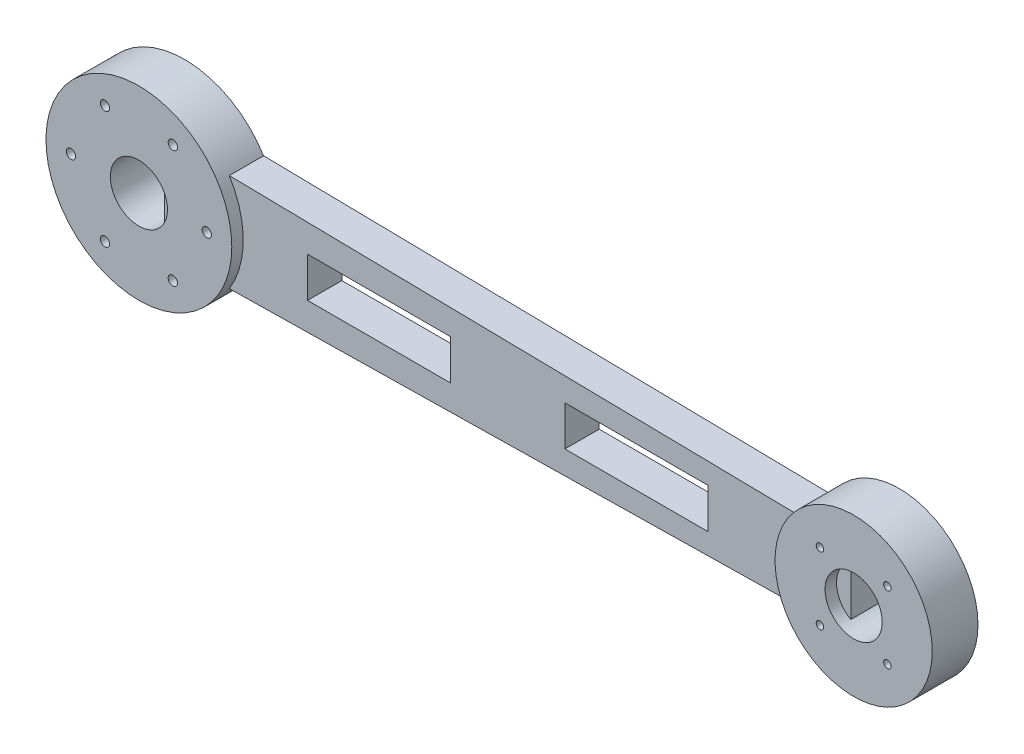
ISO-10303-21;
HEADER;
FILE_DESCRIPTION(('STEP AP214'),'2;1');
FILE_NAME('part.step','',(''),(''),'','','');
FILE_SCHEMA(('AUTOMOTIVE_DESIGN { 1 0 10303 214 1 1 1 1 }'));
ENDSEC;
DATA;
#1=APPLICATION_CONTEXT('core data for automotive mechanical design processes');
#2=APPLICATION_PROTOCOL_DEFINITION('international standard','automotive_design',2000,#1);
#3=PRODUCT_CONTEXT('',#1,'mechanical');
#4=PRODUCT('Part','Part','',(#3));
#5=PRODUCT_RELATED_PRODUCT_CATEGORY('part','',(#4));
#6=PRODUCT_DEFINITION_FORMATION('','',#4);
#7=PRODUCT_DEFINITION_CONTEXT('part definition',#1,'design');
#8=PRODUCT_DEFINITION('design','',#6,#7);
#9=PRODUCT_DEFINITION_SHAPE('','',#8);
#10=(LENGTH_UNIT() NAMED_UNIT(*) SI_UNIT(.MILLI.,.METRE.));
#11=(NAMED_UNIT(*) PLANE_ANGLE_UNIT() SI_UNIT($,.RADIAN.));
#12=(NAMED_UNIT(*) SI_UNIT($,.STERADIAN.) SOLID_ANGLE_UNIT());
#13=UNCERTAINTY_MEASURE_WITH_UNIT(LENGTH_MEASURE(1.E-05),#10,'distance_accuracy_value','');
#14=(GEOMETRIC_REPRESENTATION_CONTEXT(3) GLOBAL_UNCERTAINTY_ASSIGNED_CONTEXT((#13)) GLOBAL_UNIT_ASSIGNED_CONTEXT((#10,
#11,#12)) REPRESENTATION_CONTEXT('',''));
#15=CARTESIAN_POINT('',(0.,0.,0.));
#16=DIRECTION('',(0.,0.,1.));
#17=DIRECTION('',(1.,0.,0.));
#18=AXIS2_PLACEMENT_3D('',#15,#16,#17);
#19=CARTESIAN_POINT('',(490.,-27.,24.));
#20=DIRECTION('',(-0.0166643523339933,0.9998611400396,0.));
#21=DIRECTION('',(-0.9998611400396,-0.0166643523339933,0.));
#22=AXIS2_PLACEMENT_3D('',#19,#20,#21);
#23=PLANE('',#22);
#24=DIRECTION('',(0.,0.,-1.));
#25=VECTOR('',#24,1.);
#26=CARTESIAN_POINT('',(452.441556404354,-27.6259740599274,32.));
#27=LINE('',#26,#25);
#28=CARTESIAN_POINT('',(452.441556404354,-27.6259740599274,24.));
#29=VERTEX_POINT('',#28);
#30=CARTESIAN_POINT('',(452.441556404354,-27.6259740599274,0.));
#31=VERTEX_POINT('',#30);
#32=EDGE_CURVE('E245',#29,#31,#27,.T.);
#33=ORIENTED_EDGE('',*,*,#32,.F.);
#34=DIRECTION('',(0.9998611400396,0.0166643523339933,0.));
#35=VECTOR('',#34,1.);
#36=CARTESIAN_POINT('',(490.,-27.,24.));
#37=LINE('',#36,#35);
#38=CARTESIAN_POINT('',(55.2468945218947,-34.2458850913018,24.));
#39=VERTEX_POINT('',#38);
#40=EDGE_CURVE('E173',#39,#29,#37,.T.);
#41=ORIENTED_EDGE('',*,*,#40,.F.);
#42=DIRECTION('',(0.,0.,-1.));
#43=VECTOR('',#42,1.);
#44=CARTESIAN_POINT('',(55.2468945218947,-34.2458850913018,32.));
#45=LINE('',#44,#43);
#46=CARTESIAN_POINT('',(55.2468945218947,-34.2458850913018,0.));
#47=VERTEX_POINT('',#46);
#48=EDGE_CURVE('E56',#39,#47,#45,.T.);
#49=ORIENTED_EDGE('',*,*,#48,.T.);
#50=DIRECTION('',(0.9998611400396,0.0166643523339933,0.));
#51=VECTOR('',#50,1.);
#52=CARTESIAN_POINT('',(490.,-27.,0.));
#53=LINE('',#52,#51);
#54=EDGE_CURVE('E163',#47,#31,#53,.T.);
#55=ORIENTED_EDGE('',*,*,#54,.T.);
#56=EDGE_LOOP('',(#33,#41,#49,#55));
#57=FACE_BOUND('',#56,.T.);
#58=ADVANCED_FACE('F33',(#57),#23,.F.);
#59=CARTESIAN_POINT('',(10.,35.,24.));
#60=DIRECTION('',(-0.0166643523339933,-0.9998611400396,0.));
#61=DIRECTION('',(0.9998611400396,-0.0166643523339933,0.));
#62=AXIS2_PLACEMENT_3D('',#59,#60,#61);
#63=PLANE('',#62);
#64=DIRECTION('',(0.,0.,-1.));
#65=VECTOR('',#64,1.);
#66=CARTESIAN_POINT('',(452.441556404354,27.6259740599274,32.));
#67=LINE('',#66,#65);
#68=CARTESIAN_POINT('',(452.441556404354,27.6259740599274,0.));
#69=VERTEX_POINT('',#68);
#70=CARTESIAN_POINT('',(452.441556404354,27.6259740599274,24.));
#71=VERTEX_POINT('',#70);
#72=EDGE_CURVE('E242',#69,#71,#67,.F.);
#73=ORIENTED_EDGE('',*,*,#72,.F.);
#74=DIRECTION('',(-0.9998611400396,0.0166643523339933,0.));
#75=VECTOR('',#74,1.);
#76=CARTESIAN_POINT('',(10.,35.,0.));
#77=LINE('',#76,#75);
#78=CARTESIAN_POINT('',(55.2468945218947,34.2458850913018,0.));
#79=VERTEX_POINT('',#78);
#80=EDGE_CURVE('E162',#69,#79,#77,.T.);
#81=ORIENTED_EDGE('',*,*,#80,.T.);
#82=DIRECTION('',(0.,0.,-1.));
#83=VECTOR('',#82,1.);
#84=CARTESIAN_POINT('',(55.2468945218947,34.2458850913018,32.));
#85=LINE('',#84,#83);
#86=CARTESIAN_POINT('',(55.2468945218947,34.2458850913018,24.));
#87=VERTEX_POINT('',#86);
#88=EDGE_CURVE('E233',#79,#87,#85,.F.);
#89=ORIENTED_EDGE('',*,*,#88,.T.);
#90=DIRECTION('',(-0.9998611400396,0.0166643523339933,0.));
#91=VECTOR('',#90,1.);
#92=CARTESIAN_POINT('',(10.,35.,24.));
#93=LINE('',#92,#91);
#94=EDGE_CURVE('E319',#71,#87,#93,.T.);
#95=ORIENTED_EDGE('',*,*,#94,.F.);
#96=EDGE_LOOP('',(#73,#81,#89,#95));
#97=FACE_BOUND('',#96,.T.);
#98=ADVANCED_FACE('F362',(#97),#63,.F.);
#99=CARTESIAN_POINT('',(0.,0.,24.));
#100=DIRECTION('',(0.,0.,-1.));
#101=DIRECTION('',(-1.,0.,0.));
#102=AXIS2_PLACEMENT_3D('',#99,#100,#101);
#103=PLANE('',#102);
#104=DIRECTION('',(0.,1.,0.));
#105=VECTOR('',#104,1.);
#106=CARTESIAN_POINT('',(490.,27.,24.));
#107=LINE('',#106,#105);
#108=CARTESIAN_POINT('',(490.,-17.3205080756887,24.));
#109=VERTEX_POINT('',#108);
#110=CARTESIAN_POINT('',(490.,17.3205080756887,24.));
#111=VERTEX_POINT('',#110);
#112=EDGE_CURVE('E317',#109,#111,#107,.T.);
#113=ORIENTED_EDGE('',*,*,#112,.T.);
#114=CARTESIAN_POINT('',(500.,0.,24.));
#115=DIRECTION('',(0.,0.,-1.));
#116=DIRECTION('',(-1.,0.,0.));
#117=AXIS2_PLACEMENT_3D('',#114,#115,#116);
#118=CIRCLE('',#117,20.);
#119=EDGE_CURVE('E146',#111,#109,#118,.F.);
#120=ORIENTED_EDGE('',*,*,#119,.T.);
#121=EDGE_LOOP('',(#113,#120));
#122=FACE_BOUND('',#121,.T.);
#123=ADVANCED_FACE('F368',(#122),#103,.F.);
#124=CARTESIAN_POINT('',(0.,0.,32.));
#125=DIRECTION('',(0.,0.,-1.));
#126=DIRECTION('',(-1.,0.,0.));
#127=AXIS2_PLACEMENT_3D('',#124,#125,#126);
#128=CYLINDRICAL_SURFACE('',#127,65.);
#129=CARTESIAN_POINT('',(0.,0.,32.));
#130=DIRECTION('',(0.,0.,1.));
#131=DIRECTION('',(1.,0.,0.));
#132=AXIS2_PLACEMENT_3D('',#129,#130,#131);
#133=CIRCLE('',#132,65.);
#134=CARTESIAN_POINT('',(65.,0.,32.));
#135=VERTEX_POINT('',#134);
#136=EDGE_CURVE('E220',#135,#135,#133,.T.);
#137=ORIENTED_EDGE('',*,*,#136,.F.);
#138=EDGE_LOOP('',(#137));
#139=FACE_BOUND('',#138,.T.);
#140=ORIENTED_EDGE('',*,*,#48,.F.);
#141=CARTESIAN_POINT('',(0.,0.,24.));
#142=DIRECTION('',(0.,0.,-1.));
#143=DIRECTION('',(-1.,0.,0.));
#144=AXIS2_PLACEMENT_3D('',#141,#142,#143);
#145=CIRCLE('',#144,65.);
#146=EDGE_CURVE('E177',#87,#39,#145,.T.);
#147=ORIENTED_EDGE('',*,*,#146,.F.);
#148=ORIENTED_EDGE('',*,*,#88,.F.);
#149=CARTESIAN_POINT('',(0.,0.,0.));
#150=DIRECTION('',(0.,0.,1.));
#151=DIRECTION('',(1.,0.,0.));
#152=AXIS2_PLACEMENT_3D('',#149,#150,#151);
#153=CIRCLE('',#152,65.);
#154=EDGE_CURVE('E217',#79,#47,#153,.T.);
#155=ORIENTED_EDGE('',*,*,#154,.T.);
#156=EDGE_LOOP('',(#140,#147,#148,#155));
#157=FACE_BOUND('',#156,.T.);
#158=ADVANCED_FACE('F35',(#139,#157),#128,.T.);
#159=CARTESIAN_POINT('',(0.,0.,32.));
#160=DIRECTION('',(0.,0.,-1.));
#161=DIRECTION('',(-1.,0.,0.));
#162=AXIS2_PLACEMENT_3D('',#159,#160,#161);
#163=CYLINDRICAL_SURFACE('',#162,20.);
#164=CARTESIAN_POINT('',(0.,0.,32.));
#165=DIRECTION('',(0.,0.,1.));
#166=DIRECTION('',(1.,0.,0.));
#167=AXIS2_PLACEMENT_3D('',#164,#165,#166);
#168=CIRCLE('',#167,20.);
#169=CARTESIAN_POINT('',(20.,0.,32.));
#170=VERTEX_POINT('',#169);
#171=EDGE_CURVE('E214',#170,#170,#168,.T.);
#172=ORIENTED_EDGE('',*,*,#171,.T.);
#173=EDGE_LOOP('',(#172));
#174=FACE_BOUND('',#173,.T.);
#175=CARTESIAN_POINT('',(0.,0.,24.));
#176=DIRECTION('',(0.,0.,-1.));
#177=DIRECTION('',(-1.,0.,0.));
#178=AXIS2_PLACEMENT_3D('',#175,#176,#177);
#179=CIRCLE('',#178,20.);
#180=CARTESIAN_POINT('',(10.,17.3205080756888,24.));
#181=VERTEX_POINT('',#180);
#182=CARTESIAN_POINT('',(10.,-17.3205080756888,24.));
#183=VERTEX_POINT('',#182);
#184=EDGE_CURVE('E174',#181,#183,#179,.T.);
#185=ORIENTED_EDGE('',*,*,#184,.T.);
#186=DIRECTION('',(0.,0.,-1.));
#187=VECTOR('',#186,1.);
#188=CARTESIAN_POINT('',(10.,-17.3205080756888,32.));
#189=LINE('',#188,#187);
#190=CARTESIAN_POINT('',(10.,-17.3205080756888,0.));
#191=VERTEX_POINT('',#190);
#192=EDGE_CURVE('E230',#183,#191,#189,.T.);
#193=ORIENTED_EDGE('',*,*,#192,.T.);
#194=CARTESIAN_POINT('',(0.,0.,0.));
#195=DIRECTION('',(0.,0.,1.));
#196=DIRECTION('',(1.,0.,0.));
#197=AXIS2_PLACEMENT_3D('',#194,#195,#196);
#198=CIRCLE('',#197,20.);
#199=CARTESIAN_POINT('',(10.,17.3205080756888,0.));
#200=VERTEX_POINT('',#199);
#201=EDGE_CURVE('E213',#200,#191,#198,.T.);
#202=ORIENTED_EDGE('',*,*,#201,.F.);
#203=DIRECTION('',(0.,0.,-1.));
#204=VECTOR('',#203,1.);
#205=CARTESIAN_POINT('',(10.,17.3205080756888,32.));
#206=LINE('',#205,#204);
#207=EDGE_CURVE('E223',#200,#181,#206,.F.);
#208=ORIENTED_EDGE('',*,*,#207,.T.);
#209=EDGE_LOOP('',(#185,#193,#202,#208));
#210=FACE_BOUND('',#209,.T.);
#211=ADVANCED_FACE('F326',(#174,#210),#163,.F.);
#212=CARTESIAN_POINT('',(47.5,0.,32.));
#213=DIRECTION('',(0.,0.,-1.));
#214=DIRECTION('',(-1.,0.,0.));
#215=AXIS2_PLACEMENT_3D('',#212,#213,#214);
#216=CYLINDRICAL_SURFACE('',#215,3.25);
#217=CARTESIAN_POINT('',(47.5,0.,32.));
#218=DIRECTION('',(0.,0.,1.));
#219=DIRECTION('',(1.,0.,0.));
#220=AXIS2_PLACEMENT_3D('',#217,#218,#219);
#221=CIRCLE('',#220,3.25);
#222=CARTESIAN_POINT('',(50.75,0.,32.));
#223=VERTEX_POINT('',#222);
#224=EDGE_CURVE('E208',#223,#223,#221,.T.);
#225=ORIENTED_EDGE('',*,*,#224,.T.);
#226=EDGE_LOOP('',(#225));
#227=FACE_BOUND('',#226,.T.);
#228=CARTESIAN_POINT('',(47.5,0.,24.));
#229=DIRECTION('',(0.,0.,-1.));
#230=DIRECTION('',(-1.,0.,0.));
#231=AXIS2_PLACEMENT_3D('',#228,#229,#230);
#232=CIRCLE('',#231,3.25);
#233=CARTESIAN_POINT('',(44.25,0.,24.));
#234=VERTEX_POINT('',#233);
#235=EDGE_CURVE('E178',#234,#234,#232,.T.);
#236=ORIENTED_EDGE('',*,*,#235,.T.);
#237=EDGE_LOOP('',(#236));
#238=FACE_BOUND('',#237,.T.);
#239=ADVANCED_FACE('F392',(#227,#238),#216,.F.);
#240=CARTESIAN_POINT('',(0.,0.,32.));
#241=DIRECTION('',(0.,0.,1.));
#242=DIRECTION('',(1.,0.,0.));
#243=AXIS2_PLACEMENT_3D('',#240,#241,#242);
#244=PLANE('',#243);
#245=CARTESIAN_POINT('',(-23.75,-41.1362066797608,32.));
#246=DIRECTION('',(0.,0.,1.));
#247=DIRECTION('',(1.,0.,0.));
#248=AXIS2_PLACEMENT_3D('',#245,#246,#247);
#249=CIRCLE('',#248,3.24999999999997);
#250=CARTESIAN_POINT('',(-20.5,-41.1362066797608,32.));
#251=VERTEX_POINT('',#250);
#252=EDGE_CURVE('E187',#251,#251,#249,.T.);
#253=ORIENTED_EDGE('',*,*,#252,.F.);
#254=EDGE_LOOP('',(#253));
#255=FACE_BOUND('',#254,.T.);
#256=CARTESIAN_POINT('',(-23.75,41.1362066797608,32.));
#257=DIRECTION('',(0.,0.,1.));
#258=DIRECTION('',(1.,0.,0.));
#259=AXIS2_PLACEMENT_3D('',#256,#257,#258);
#260=CIRCLE('',#259,3.25);
#261=CARTESIAN_POINT('',(-20.5,41.1362066797608,32.));
#262=VERTEX_POINT('',#261);
#263=EDGE_CURVE('E199',#262,#262,#260,.T.);
#264=ORIENTED_EDGE('',*,*,#263,.F.);
#265=EDGE_LOOP('',(#264));
#266=FACE_BOUND('',#265,.T.);
#267=ORIENTED_EDGE('',*,*,#224,.F.);
#268=EDGE_LOOP('',(#267));
#269=FACE_BOUND('',#268,.T.);
#270=ORIENTED_EDGE('',*,*,#136,.T.);
#271=EDGE_LOOP('',(#270));
#272=FACE_BOUND('',#271,.T.);
#273=ORIENTED_EDGE('',*,*,#171,.F.);
#274=EDGE_LOOP('',(#273));
#275=FACE_BOUND('',#274,.T.);
#276=CARTESIAN_POINT('',(23.75,41.1362066797608,32.));
#277=DIRECTION('',(0.,0.,1.));
#278=DIRECTION('',(1.,0.,0.));
#279=AXIS2_PLACEMENT_3D('',#276,#277,#278);
#280=CIRCLE('',#279,3.25);
#281=CARTESIAN_POINT('',(27.,41.1362066797608,32.));
#282=VERTEX_POINT('',#281);
#283=EDGE_CURVE('E205',#282,#282,#280,.T.);
#284=ORIENTED_EDGE('',*,*,#283,.F.);
#285=EDGE_LOOP('',(#284));
#286=FACE_BOUND('',#285,.T.);
#287=CARTESIAN_POINT('',(-47.5,0.,32.));
#288=DIRECTION('',(0.,0.,1.));
#289=DIRECTION('',(1.,0.,0.));
#290=AXIS2_PLACEMENT_3D('',#287,#288,#289);
#291=CIRCLE('',#290,3.25);
#292=CARTESIAN_POINT('',(-44.25,0.,32.));
#293=VERTEX_POINT('',#292);
#294=EDGE_CURVE('E193',#293,#293,#291,.T.);
#295=ORIENTED_EDGE('',*,*,#294,.F.);
#296=EDGE_LOOP('',(#295));
#297=FACE_BOUND('',#296,.T.);
#298=CARTESIAN_POINT('',(23.75,-41.1362066797608,32.));
#299=DIRECTION('',(0.,0.,1.));
#300=DIRECTION('',(1.,0.,0.));
#301=AXIS2_PLACEMENT_3D('',#298,#299,#300);
#302=CIRCLE('',#301,3.24999999999996);
#303=CARTESIAN_POINT('',(27.,-41.1362066797608,32.));
#304=VERTEX_POINT('',#303);
#305=EDGE_CURVE('E181',#304,#304,#302,.T.);
#306=ORIENTED_EDGE('',*,*,#305,.F.);
#307=EDGE_LOOP('',(#306));
#308=FACE_BOUND('',#307,.T.);
#309=ADVANCED_FACE('F334',(#255,#266,#269,#272,#275,#286,#297,#308),#244,.T.);
#310=CARTESIAN_POINT('',(0.,0.,0.));
#311=DIRECTION('',(0.,0.,1.));
#312=DIRECTION('',(1.,0.,0.));
#313=AXIS2_PLACEMENT_3D('',#310,#311,#312);
#314=PLANE('',#313);
#315=ORIENTED_EDGE('',*,*,#80,.F.);
#316=CARTESIAN_POINT('',(500.,0.,0.));
#317=DIRECTION('',(0.,0.,1.));
#318=DIRECTION('',(1.,0.,0.));
#319=AXIS2_PLACEMENT_3D('',#316,#317,#318);
#320=CIRCLE('',#319,55.0000000000001);
#321=EDGE_CURVE('E725',#31,#69,#320,.T.);
#322=ORIENTED_EDGE('',*,*,#321,.F.);
#323=ORIENTED_EDGE('',*,*,#54,.F.);
#324=ORIENTED_EDGE('',*,*,#154,.F.);
#325=EDGE_LOOP('',(#315,#322,#323,#324));
#326=FACE_BOUND('',#325,.T.);
#327=ORIENTED_EDGE('',*,*,#201,.T.);
#328=DIRECTION('',(0.,-1.,0.));
#329=VECTOR('',#328,1.);
#330=CARTESIAN_POINT('',(10.,-35.,0.));
#331=LINE('',#330,#329);
#332=EDGE_CURVE('E165',#200,#191,#331,.T.);
#333=ORIENTED_EDGE('',*,*,#332,.F.);
#334=EDGE_LOOP('',(#327,#333));
#335=FACE_BOUND('',#334,.T.);
#336=DIRECTION('',(1.,0.,0.));
#337=VECTOR('',#336,1.);
#338=CARTESIAN_POINT('',(110.,-14.,0.));
#339=LINE('',#338,#337);
#340=CARTESIAN_POINT('',(110.,-14.,0.));
#341=VERTEX_POINT('',#340);
#342=CARTESIAN_POINT('',(210.,-14.,0.));
#343=VERTEX_POINT('',#342);
#344=EDGE_CURVE('E289',#341,#343,#339,.T.);
#345=ORIENTED_EDGE('',*,*,#344,.T.);
#346=DIRECTION('',(0.,1.,0.));
#347=VECTOR('',#346,1.);
#348=CARTESIAN_POINT('',(210.,-14.,0.));
#349=LINE('',#348,#347);
#350=CARTESIAN_POINT('',(210.,14.,0.));
#351=VERTEX_POINT('',#350);
#352=EDGE_CURVE('E285',#343,#351,#349,.T.);
#353=ORIENTED_EDGE('',*,*,#352,.T.);
#354=DIRECTION('',(-1.,0.,0.));
#355=VECTOR('',#354,1.);
#356=CARTESIAN_POINT('',(110.,14.,0.));
#357=LINE('',#356,#355);
#358=CARTESIAN_POINT('',(110.,14.,0.));
#359=VERTEX_POINT('',#358);
#360=EDGE_CURVE('E299',#351,#359,#357,.T.);
#361=ORIENTED_EDGE('',*,*,#360,.T.);
#362=DIRECTION('',(0.,-1.,0.));
#363=VECTOR('',#362,1.);
#364=CARTESIAN_POINT('',(110.,-14.,0.));
#365=LINE('',#364,#363);
#366=EDGE_CURVE('E302',#359,#341,#365,.T.);
#367=ORIENTED_EDGE('',*,*,#366,.T.);
#368=EDGE_LOOP('',(#345,#353,#361,#367));
#369=FACE_BOUND('',#368,.T.);
#370=DIRECTION('',(1.,0.,0.));
#371=VECTOR('',#370,1.);
#372=CARTESIAN_POINT('',(290.,-14.,0.));
#373=LINE('',#372,#371);
#374=CARTESIAN_POINT('',(290.,-14.,0.));
#375=VERTEX_POINT('',#374);
#376=CARTESIAN_POINT('',(390.,-14.,0.));
#377=VERTEX_POINT('',#376);
#378=EDGE_CURVE('E258',#375,#377,#373,.T.);
#379=ORIENTED_EDGE('',*,*,#378,.T.);
#380=DIRECTION('',(0.,1.,0.));
#381=VECTOR('',#380,1.);
#382=CARTESIAN_POINT('',(390.,-14.,0.));
#383=LINE('',#382,#381);
#384=CARTESIAN_POINT('',(390.,14.,0.));
#385=VERTEX_POINT('',#384);
#386=EDGE_CURVE('E250',#377,#385,#383,.T.);
#387=ORIENTED_EDGE('',*,*,#386,.T.);
#388=DIRECTION('',(-1.,0.,0.));
#389=VECTOR('',#388,1.);
#390=CARTESIAN_POINT('',(290.,14.,0.));
#391=LINE('',#390,#389);
#392=CARTESIAN_POINT('',(290.,14.,0.));
#393=VERTEX_POINT('',#392);
#394=EDGE_CURVE('E268',#385,#393,#391,.T.);
#395=ORIENTED_EDGE('',*,*,#394,.T.);
#396=DIRECTION('',(0.,-1.,0.));
#397=VECTOR('',#396,1.);
#398=CARTESIAN_POINT('',(290.,-14.,0.));
#399=LINE('',#398,#397);
#400=EDGE_CURVE('E271',#393,#375,#399,.T.);
#401=ORIENTED_EDGE('',*,*,#400,.T.);
#402=EDGE_LOOP('',(#379,#387,#395,#401));
#403=FACE_BOUND('',#402,.T.);
#404=CARTESIAN_POINT('',(23.75,-41.1362066797608,0.));
#405=DIRECTION('',(0.,0.,1.));
#406=DIRECTION('',(1.,0.,0.));
#407=AXIS2_PLACEMENT_3D('',#404,#405,#406);
#408=CIRCLE('',#407,3.24999999999996);
#409=CARTESIAN_POINT('',(27.,-41.1362066797608,0.));
#410=VERTEX_POINT('',#409);
#411=EDGE_CURVE('E180',#410,#410,#408,.T.);
#412=ORIENTED_EDGE('',*,*,#411,.T.);
#413=EDGE_LOOP('',(#412));
#414=FACE_BOUND('',#413,.T.);
#415=CARTESIAN_POINT('',(-23.75,-41.1362066797608,0.));
#416=DIRECTION('',(0.,0.,1.));
#417=DIRECTION('',(1.,0.,0.));
#418=AXIS2_PLACEMENT_3D('',#415,#416,#417);
#419=CIRCLE('',#418,3.24999999999997);
#420=CARTESIAN_POINT('',(-20.5,-41.1362066797608,0.));
#421=VERTEX_POINT('',#420);
#422=EDGE_CURVE('E184',#421,#421,#419,.T.);
#423=ORIENTED_EDGE('',*,*,#422,.T.);
#424=EDGE_LOOP('',(#423));
#425=FACE_BOUND('',#424,.T.);
#426=CARTESIAN_POINT('',(-47.5,0.,0.));
#427=DIRECTION('',(0.,0.,1.));
#428=DIRECTION('',(1.,0.,0.));
#429=AXIS2_PLACEMENT_3D('',#426,#427,#428);
#430=CIRCLE('',#429,3.25);
#431=CARTESIAN_POINT('',(-44.25,0.,0.));
#432=VERTEX_POINT('',#431);
#433=EDGE_CURVE('E190',#432,#432,#430,.T.);
#434=ORIENTED_EDGE('',*,*,#433,.T.);
#435=EDGE_LOOP('',(#434));
#436=FACE_BOUND('',#435,.T.);
#437=CARTESIAN_POINT('',(-23.75,41.1362066797608,0.));
#438=DIRECTION('',(0.,0.,1.));
#439=DIRECTION('',(1.,0.,0.));
#440=AXIS2_PLACEMENT_3D('',#437,#438,#439);
#441=CIRCLE('',#440,3.25);
#442=CARTESIAN_POINT('',(-20.5,41.1362066797608,0.));
#443=VERTEX_POINT('',#442);
#444=EDGE_CURVE('E196',#443,#443,#441,.T.);
#445=ORIENTED_EDGE('',*,*,#444,.T.);
#446=EDGE_LOOP('',(#445));
#447=FACE_BOUND('',#446,.T.);
#448=CARTESIAN_POINT('',(23.75,41.1362066797608,0.));
#449=DIRECTION('',(0.,0.,1.));
#450=DIRECTION('',(1.,0.,0.));
#451=AXIS2_PLACEMENT_3D('',#448,#449,#450);
#452=CIRCLE('',#451,3.25);
#453=CARTESIAN_POINT('',(27.,41.1362066797608,0.));
#454=VERTEX_POINT('',#453);
#455=EDGE_CURVE('E202',#454,#454,#452,.T.);
#456=ORIENTED_EDGE('',*,*,#455,.T.);
#457=EDGE_LOOP('',(#456));
#458=FACE_BOUND('',#457,.T.);
#459=CARTESIAN_POINT('',(500.,0.,0.));
#460=DIRECTION('',(0.,0.,1.));
#461=DIRECTION('',(1.,0.,0.));
#462=AXIS2_PLACEMENT_3D('',#459,#460,#461);
#463=CIRCLE('',#462,20.);
#464=CARTESIAN_POINT('',(490.,-17.3205080756887,0.));
#465=VERTEX_POINT('',#464);
#466=CARTESIAN_POINT('',(490.,17.3205080756887,0.));
#467=VERTEX_POINT('',#466);
#468=EDGE_CURVE('E48',#465,#467,#463,.T.);
#469=ORIENTED_EDGE('',*,*,#468,.T.);
#470=DIRECTION('',(0.,1.,0.));
#471=VECTOR('',#470,1.);
#472=CARTESIAN_POINT('',(490.,27.,0.));
#473=LINE('',#472,#471);
#474=EDGE_CURVE('E157',#465,#467,#473,.T.);
#475=ORIENTED_EDGE('',*,*,#474,.F.);
#476=EDGE_LOOP('',(#469,#475));
#477=FACE_BOUND('',#476,.T.);
#478=CARTESIAN_POINT('',(523.57,23.57,0.));
#479=DIRECTION('',(0.,0.,1.));
#480=DIRECTION('',(1.,0.,0.));
#481=AXIS2_PLACEMENT_3D('',#478,#479,#480);
#482=CIRCLE('',#481,2.60000000000007);
#483=CARTESIAN_POINT('',(526.17,23.57,0.));
#484=VERTEX_POINT('',#483);
#485=EDGE_CURVE('E709',#484,#484,#482,.T.);
#486=ORIENTED_EDGE('',*,*,#485,.T.);
#487=EDGE_LOOP('',(#486));
#488=FACE_BOUND('',#487,.T.);
#489=CARTESIAN_POINT('',(523.57,-23.57,0.));
#490=DIRECTION('',(0.,0.,1.));
#491=DIRECTION('',(1.,0.,0.));
#492=AXIS2_PLACEMENT_3D('',#489,#490,#491);
#493=CIRCLE('',#492,2.60000000000007);
#494=CARTESIAN_POINT('',(526.17,-23.57,0.));
#495=VERTEX_POINT('',#494);
#496=EDGE_CURVE('E711',#495,#495,#493,.T.);
#497=ORIENTED_EDGE('',*,*,#496,.T.);
#498=EDGE_LOOP('',(#497));
#499=FACE_BOUND('',#498,.T.);
#500=ADVANCED_FACE('F155',(#326,#335,#369,#403,#414,#425,#436,#447,#458,#477,#488,#499),#314,.F.);
#501=CARTESIAN_POINT('',(23.75,41.1362066797608,32.));
#502=DIRECTION('',(0.,0.,-1.));
#503=DIRECTION('',(-1.,0.,0.));
#504=AXIS2_PLACEMENT_3D('',#501,#502,#503);
#505=CYLINDRICAL_SURFACE('',#504,3.25);
#506=ORIENTED_EDGE('',*,*,#283,.T.);
#507=EDGE_LOOP('',(#506));
#508=FACE_BOUND('',#507,.T.);
#509=ORIENTED_EDGE('',*,*,#455,.F.);
#510=EDGE_LOOP('',(#509));
#511=FACE_BOUND('',#510,.T.);
#512=ADVANCED_FACE('F333',(#508,#511),#505,.F.);
#513=CARTESIAN_POINT('',(-23.75,41.1362066797608,32.));
#514=DIRECTION('',(0.,0.,-1.));
#515=DIRECTION('',(-1.,0.,0.));
#516=AXIS2_PLACEMENT_3D('',#513,#514,#515);
#517=CYLINDRICAL_SURFACE('',#516,3.25);
#518=ORIENTED_EDGE('',*,*,#263,.T.);
#519=EDGE_LOOP('',(#518));
#520=FACE_BOUND('',#519,.T.);
#521=ORIENTED_EDGE('',*,*,#444,.F.);
#522=EDGE_LOOP('',(#521));
#523=FACE_BOUND('',#522,.T.);
#524=ADVANCED_FACE('F351',(#520,#523),#517,.F.);
#525=CARTESIAN_POINT('',(-47.5,0.,32.));
#526=DIRECTION('',(0.,0.,-1.));
#527=DIRECTION('',(-1.,0.,0.));
#528=AXIS2_PLACEMENT_3D('',#525,#526,#527);
#529=CYLINDRICAL_SURFACE('',#528,3.25);
#530=ORIENTED_EDGE('',*,*,#294,.T.);
#531=EDGE_LOOP('',(#530));
#532=FACE_BOUND('',#531,.T.);
#533=ORIENTED_EDGE('',*,*,#433,.F.);
#534=EDGE_LOOP('',(#533));
#535=FACE_BOUND('',#534,.T.);
#536=ADVANCED_FACE('F357',(#532,#535),#529,.F.);
#537=CARTESIAN_POINT('',(-23.75,-41.1362066797608,32.));
#538=DIRECTION('',(0.,0.,-1.));
#539=DIRECTION('',(-1.,0.,0.));
#540=AXIS2_PLACEMENT_3D('',#537,#538,#539);
#541=CYLINDRICAL_SURFACE('',#540,3.24999999999997);
#542=ORIENTED_EDGE('',*,*,#252,.T.);
#543=EDGE_LOOP('',(#542));
#544=FACE_BOUND('',#543,.T.);
#545=ORIENTED_EDGE('',*,*,#422,.F.);
#546=EDGE_LOOP('',(#545));
#547=FACE_BOUND('',#546,.T.);
#548=ADVANCED_FACE('F378',(#544,#547),#541,.F.);
#549=CARTESIAN_POINT('',(23.75,-41.1362066797608,32.));
#550=DIRECTION('',(0.,0.,-1.));
#551=DIRECTION('',(-1.,0.,0.));
#552=AXIS2_PLACEMENT_3D('',#549,#550,#551);
#553=CYLINDRICAL_SURFACE('',#552,3.24999999999996);
#554=ORIENTED_EDGE('',*,*,#305,.T.);
#555=EDGE_LOOP('',(#554));
#556=FACE_BOUND('',#555,.T.);
#557=ORIENTED_EDGE('',*,*,#411,.F.);
#558=EDGE_LOOP('',(#557));
#559=FACE_BOUND('',#558,.T.);
#560=ADVANCED_FACE('F374',(#556,#559),#553,.F.);
#561=ORIENTED_EDGE('',*,*,#235,.F.);
#562=EDGE_LOOP('',(#561));
#563=FACE_BOUND('',#562,.T.);
#564=ADVANCED_FACE('F377',(#563),#103,.F.);
#565=CARTESIAN_POINT('',(10.,-35.,24.));
#566=DIRECTION('',(1.,0.,0.));
#567=DIRECTION('',(0.,0.,-1.));
#568=AXIS2_PLACEMENT_3D('',#565,#566,#567);
#569=PLANE('',#568);
#570=ORIENTED_EDGE('',*,*,#192,.F.);
#571=DIRECTION('',(0.,-1.,0.));
#572=VECTOR('',#571,1.);
#573=CARTESIAN_POINT('',(10.,-35.,24.));
#574=LINE('',#573,#572);
#575=EDGE_CURVE('E227',#181,#183,#574,.T.);
#576=ORIENTED_EDGE('',*,*,#575,.F.);
#577=ORIENTED_EDGE('',*,*,#207,.F.);
#578=ORIENTED_EDGE('',*,*,#332,.T.);
#579=EDGE_LOOP('',(#570,#576,#577,#578));
#580=FACE_BOUND('',#579,.T.);
#581=ADVANCED_FACE('F329',(#580),#569,.F.);
#582=ORIENTED_EDGE('',*,*,#184,.F.);
#583=ORIENTED_EDGE('',*,*,#575,.T.);
#584=EDGE_LOOP('',(#582,#583));
#585=FACE_BOUND('',#584,.T.);
#586=ADVANCED_FACE('F323',(#585),#103,.F.);
#587=CARTESIAN_POINT('',(500.,0.,24.));
#588=DIRECTION('',(0.,0.,-1.));
#589=DIRECTION('',(-1.,0.,0.));
#590=AXIS2_PLACEMENT_3D('',#587,#588,#589);
#591=CIRCLE('',#590,55.0000000000001);
#592=EDGE_CURVE('E11',#71,#29,#591,.F.);
#593=ORIENTED_EDGE('',*,*,#592,.F.);
#594=ORIENTED_EDGE('',*,*,#94,.T.);
#595=ORIENTED_EDGE('',*,*,#146,.T.);
#596=ORIENTED_EDGE('',*,*,#40,.T.);
#597=EDGE_LOOP('',(#593,#594,#595,#596));
#598=FACE_BOUND('',#597,.T.);
#599=DIRECTION('',(0.,1.,0.));
#600=VECTOR('',#599,1.);
#601=CARTESIAN_POINT('',(210.,-14.,24.));
#602=LINE('',#601,#600);
#603=CARTESIAN_POINT('',(210.,-14.,24.));
#604=VERTEX_POINT('',#603);
#605=CARTESIAN_POINT('',(210.,14.,24.));
#606=VERTEX_POINT('',#605);
#607=EDGE_CURVE('E286',#604,#606,#602,.T.);
#608=ORIENTED_EDGE('',*,*,#607,.F.);
#609=DIRECTION('',(1.,0.,0.));
#610=VECTOR('',#609,1.);
#611=CARTESIAN_POINT('',(110.,-14.,24.));
#612=LINE('',#611,#610);
#613=CARTESIAN_POINT('',(110.,-14.,24.));
#614=VERTEX_POINT('',#613);
#615=EDGE_CURVE('E294',#614,#604,#612,.T.);
#616=ORIENTED_EDGE('',*,*,#615,.F.);
#617=DIRECTION('',(0.,-1.,0.));
#618=VECTOR('',#617,1.);
#619=CARTESIAN_POINT('',(110.,-14.,24.));
#620=LINE('',#619,#618);
#621=CARTESIAN_POINT('',(110.,14.,24.));
#622=VERTEX_POINT('',#621);
#623=EDGE_CURVE('E291',#622,#614,#620,.T.);
#624=ORIENTED_EDGE('',*,*,#623,.F.);
#625=DIRECTION('',(-1.,0.,0.));
#626=VECTOR('',#625,1.);
#627=CARTESIAN_POINT('',(110.,14.,24.));
#628=LINE('',#627,#626);
#629=EDGE_CURVE('E288',#606,#622,#628,.T.);
#630=ORIENTED_EDGE('',*,*,#629,.F.);
#631=EDGE_LOOP('',(#608,#616,#624,#630));
#632=FACE_BOUND('',#631,.T.);
#633=DIRECTION('',(0.,1.,0.));
#634=VECTOR('',#633,1.);
#635=CARTESIAN_POINT('',(390.,-14.,24.));
#636=LINE('',#635,#634);
#637=CARTESIAN_POINT('',(390.,-14.,24.));
#638=VERTEX_POINT('',#637);
#639=CARTESIAN_POINT('',(390.,14.,24.));
#640=VERTEX_POINT('',#639);
#641=EDGE_CURVE('E255',#638,#640,#636,.T.);
#642=ORIENTED_EDGE('',*,*,#641,.F.);
#643=DIRECTION('',(1.,0.,0.));
#644=VECTOR('',#643,1.);
#645=CARTESIAN_POINT('',(290.,-14.,24.));
#646=LINE('',#645,#644);
#647=CARTESIAN_POINT('',(290.,-14.,24.));
#648=VERTEX_POINT('',#647);
#649=EDGE_CURVE('E263',#648,#638,#646,.T.);
#650=ORIENTED_EDGE('',*,*,#649,.F.);
#651=DIRECTION('',(0.,-1.,0.));
#652=VECTOR('',#651,1.);
#653=CARTESIAN_POINT('',(290.,-14.,24.));
#654=LINE('',#653,#652);
#655=CARTESIAN_POINT('',(290.,14.,24.));
#656=VERTEX_POINT('',#655);
#657=EDGE_CURVE('E260',#656,#648,#654,.T.);
#658=ORIENTED_EDGE('',*,*,#657,.F.);
#659=DIRECTION('',(-1.,0.,0.));
#660=VECTOR('',#659,1.);
#661=CARTESIAN_POINT('',(290.,14.,24.));
#662=LINE('',#661,#660);
#663=EDGE_CURVE('E257',#640,#656,#662,.T.);
#664=ORIENTED_EDGE('',*,*,#663,.F.);
#665=EDGE_LOOP('',(#642,#650,#658,#664));
#666=FACE_BOUND('',#665,.T.);
#667=ADVANCED_FACE('F420',(#598,#632,#666),#103,.F.);
#668=CARTESIAN_POINT('',(490.,27.,24.));
#669=DIRECTION('',(-1.,0.,0.));
#670=DIRECTION('',(0.,0.,1.));
#671=AXIS2_PLACEMENT_3D('',#668,#669,#670);
#672=PLANE('',#671);
#673=ORIENTED_EDGE('',*,*,#474,.T.);
#674=DIRECTION('',(0.,0.,-1.));
#675=VECTOR('',#674,1.);
#676=CARTESIAN_POINT('',(490.,17.3205080756887,32.));
#677=LINE('',#676,#675);
#678=EDGE_CURVE('E41',#467,#111,#677,.F.);
#679=ORIENTED_EDGE('',*,*,#678,.T.);
#680=ORIENTED_EDGE('',*,*,#112,.F.);
#681=DIRECTION('',(0.,0.,-1.));
#682=VECTOR('',#681,1.);
#683=CARTESIAN_POINT('',(490.,-17.3205080756887,32.));
#684=LINE('',#683,#682);
#685=EDGE_CURVE('E151',#109,#465,#684,.T.);
#686=ORIENTED_EDGE('',*,*,#685,.T.);
#687=EDGE_LOOP('',(#673,#679,#680,#686));
#688=FACE_BOUND('',#687,.T.);
#689=ADVANCED_FACE('F161',(#688),#672,.F.);
#690=CARTESIAN_POINT('',(210.,-14.,24.));
#691=DIRECTION('',(-1.,0.,0.));
#692=DIRECTION('',(0.,0.,1.));
#693=AXIS2_PLACEMENT_3D('',#690,#691,#692);
#694=PLANE('',#693);
#695=ORIENTED_EDGE('',*,*,#352,.F.);
#696=DIRECTION('',(0.,0.,-1.));
#697=VECTOR('',#696,1.);
#698=CARTESIAN_POINT('',(210.,-14.,24.));
#699=LINE('',#698,#697);
#700=EDGE_CURVE('E296',#604,#343,#699,.T.);
#701=ORIENTED_EDGE('',*,*,#700,.F.);
#702=ORIENTED_EDGE('',*,*,#607,.T.);
#703=DIRECTION('',(0.,0.,-1.));
#704=VECTOR('',#703,1.);
#705=CARTESIAN_POINT('',(210.,14.,24.));
#706=LINE('',#705,#704);
#707=EDGE_CURVE('E168',#606,#351,#706,.T.);
#708=ORIENTED_EDGE('',*,*,#707,.T.);
#709=EDGE_LOOP('',(#695,#701,#702,#708));
#710=FACE_BOUND('',#709,.T.);
#711=ADVANCED_FACE('F435',(#710),#694,.T.);
#712=CARTESIAN_POINT('',(110.,14.,24.));
#713=DIRECTION('',(0.,-1.,0.));
#714=DIRECTION('',(0.,0.,-1.));
#715=AXIS2_PLACEMENT_3D('',#712,#713,#714);
#716=PLANE('',#715);
#717=ORIENTED_EDGE('',*,*,#360,.F.);
#718=ORIENTED_EDGE('',*,*,#707,.F.);
#719=ORIENTED_EDGE('',*,*,#629,.T.);
#720=DIRECTION('',(0.,0.,-1.));
#721=VECTOR('',#720,1.);
#722=CARTESIAN_POINT('',(110.,14.,24.));
#723=LINE('',#722,#721);
#724=EDGE_CURVE('E311',#622,#359,#723,.T.);
#725=ORIENTED_EDGE('',*,*,#724,.T.);
#726=EDGE_LOOP('',(#717,#718,#719,#725));
#727=FACE_BOUND('',#726,.T.);
#728=ADVANCED_FACE('F469',(#727),#716,.T.);
#729=CARTESIAN_POINT('',(110.,-14.,24.));
#730=DIRECTION('',(1.,0.,0.));
#731=DIRECTION('',(0.,0.,-1.));
#732=AXIS2_PLACEMENT_3D('',#729,#730,#731);
#733=PLANE('',#732);
#734=ORIENTED_EDGE('',*,*,#366,.F.);
#735=ORIENTED_EDGE('',*,*,#724,.F.);
#736=ORIENTED_EDGE('',*,*,#623,.T.);
#737=DIRECTION('',(0.,0.,-1.));
#738=VECTOR('',#737,1.);
#739=CARTESIAN_POINT('',(110.,-14.,24.));
#740=LINE('',#739,#738);
#741=EDGE_CURVE('E309',#614,#341,#740,.T.);
#742=ORIENTED_EDGE('',*,*,#741,.T.);
#743=EDGE_LOOP('',(#734,#735,#736,#742));
#744=FACE_BOUND('',#743,.T.);
#745=ADVANCED_FACE('F478',(#744),#733,.T.);
#746=CARTESIAN_POINT('',(110.,-14.,24.));
#747=DIRECTION('',(0.,1.,0.));
#748=DIRECTION('',(0.,0.,1.));
#749=AXIS2_PLACEMENT_3D('',#746,#747,#748);
#750=PLANE('',#749);
#751=ORIENTED_EDGE('',*,*,#344,.F.);
#752=ORIENTED_EDGE('',*,*,#741,.F.);
#753=ORIENTED_EDGE('',*,*,#615,.T.);
#754=ORIENTED_EDGE('',*,*,#700,.T.);
#755=EDGE_LOOP('',(#751,#752,#753,#754));
#756=FACE_BOUND('',#755,.T.);
#757=ADVANCED_FACE('F488',(#756),#750,.T.);
#758=CARTESIAN_POINT('',(390.,-14.,24.));
#759=DIRECTION('',(-1.,0.,0.));
#760=DIRECTION('',(0.,0.,1.));
#761=AXIS2_PLACEMENT_3D('',#758,#759,#760);
#762=PLANE('',#761);
#763=ORIENTED_EDGE('',*,*,#386,.F.);
#764=DIRECTION('',(0.,0.,-1.));
#765=VECTOR('',#764,1.);
#766=CARTESIAN_POINT('',(390.,-14.,24.));
#767=LINE('',#766,#765);
#768=EDGE_CURVE('E265',#638,#377,#767,.T.);
#769=ORIENTED_EDGE('',*,*,#768,.F.);
#770=ORIENTED_EDGE('',*,*,#641,.T.);
#771=DIRECTION('',(0.,0.,-1.));
#772=VECTOR('',#771,1.);
#773=CARTESIAN_POINT('',(390.,14.,24.));
#774=LINE('',#773,#772);
#775=EDGE_CURVE('E282',#640,#385,#774,.T.);
#776=ORIENTED_EDGE('',*,*,#775,.T.);
#777=EDGE_LOOP('',(#763,#769,#770,#776));
#778=FACE_BOUND('',#777,.T.);
#779=ADVANCED_FACE('F498',(#778),#762,.T.);
#780=CARTESIAN_POINT('',(290.,14.,24.));
#781=DIRECTION('',(0.,-1.,0.));
#782=DIRECTION('',(0.,0.,-1.));
#783=AXIS2_PLACEMENT_3D('',#780,#781,#782);
#784=PLANE('',#783);
#785=ORIENTED_EDGE('',*,*,#394,.F.);
#786=ORIENTED_EDGE('',*,*,#775,.F.);
#787=ORIENTED_EDGE('',*,*,#663,.T.);
#788=DIRECTION('',(0.,0.,-1.));
#789=VECTOR('',#788,1.);
#790=CARTESIAN_POINT('',(290.,14.,24.));
#791=LINE('',#790,#789);
#792=EDGE_CURVE('E280',#656,#393,#791,.T.);
#793=ORIENTED_EDGE('',*,*,#792,.T.);
#794=EDGE_LOOP('',(#785,#786,#787,#793));
#795=FACE_BOUND('',#794,.T.);
#796=ADVANCED_FACE('F508',(#795),#784,.T.);
#797=CARTESIAN_POINT('',(290.,-14.,24.));
#798=DIRECTION('',(1.,0.,0.));
#799=DIRECTION('',(0.,0.,-1.));
#800=AXIS2_PLACEMENT_3D('',#797,#798,#799);
#801=PLANE('',#800);
#802=ORIENTED_EDGE('',*,*,#400,.F.);
#803=ORIENTED_EDGE('',*,*,#792,.F.);
#804=ORIENTED_EDGE('',*,*,#657,.T.);
#805=DIRECTION('',(0.,0.,-1.));
#806=VECTOR('',#805,1.);
#807=CARTESIAN_POINT('',(290.,-14.,24.));
#808=LINE('',#807,#806);
#809=EDGE_CURVE('E278',#648,#375,#808,.T.);
#810=ORIENTED_EDGE('',*,*,#809,.T.);
#811=EDGE_LOOP('',(#802,#803,#804,#810));
#812=FACE_BOUND('',#811,.T.);
#813=ADVANCED_FACE('F518',(#812),#801,.T.);
#814=CARTESIAN_POINT('',(290.,-14.,24.));
#815=DIRECTION('',(0.,1.,0.));
#816=DIRECTION('',(0.,0.,1.));
#817=AXIS2_PLACEMENT_3D('',#814,#815,#816);
#818=PLANE('',#817);
#819=ORIENTED_EDGE('',*,*,#378,.F.);
#820=ORIENTED_EDGE('',*,*,#809,.F.);
#821=ORIENTED_EDGE('',*,*,#649,.T.);
#822=ORIENTED_EDGE('',*,*,#768,.T.);
#823=EDGE_LOOP('',(#819,#820,#821,#822));
#824=FACE_BOUND('',#823,.T.);
#825=ADVANCED_FACE('F528',(#824),#818,.T.);
#826=CARTESIAN_POINT('',(500.,0.,32.));
#827=DIRECTION('',(0.,0.,-1.));
#828=DIRECTION('',(-1.,0.,0.));
#829=AXIS2_PLACEMENT_3D('',#826,#827,#828);
#830=CYLINDRICAL_SURFACE('',#829,55.0000000000001);
#831=CARTESIAN_POINT('',(500.,0.,32.));
#832=DIRECTION('',(0.,0.,1.));
#833=DIRECTION('',(1.,0.,0.));
#834=AXIS2_PLACEMENT_3D('',#831,#832,#833);
#835=CIRCLE('',#834,55.0000000000001);
#836=CARTESIAN_POINT('',(555.,0.,32.));
#837=VERTEX_POINT('',#836);
#838=EDGE_CURVE('E727',#837,#837,#835,.T.);
#839=ORIENTED_EDGE('',*,*,#838,.F.);
#840=EDGE_LOOP('',(#839));
#841=FACE_BOUND('',#840,.T.);
#842=ORIENTED_EDGE('',*,*,#592,.T.);
#843=ORIENTED_EDGE('',*,*,#32,.T.);
#844=ORIENTED_EDGE('',*,*,#321,.T.);
#845=ORIENTED_EDGE('',*,*,#72,.T.);
#846=EDGE_LOOP('',(#842,#843,#844,#845));
#847=FACE_BOUND('',#846,.T.);
#848=ADVANCED_FACE('F538',(#841,#847),#830,.T.);
#849=CARTESIAN_POINT('',(476.43,-23.57,32.));
#850=DIRECTION('',(0.,0.,-1.));
#851=DIRECTION('',(-1.,0.,0.));
#852=AXIS2_PLACEMENT_3D('',#849,#850,#851);
#853=CYLINDRICAL_SURFACE('',#852,2.60000000000002);
#854=CARTESIAN_POINT('',(476.43,-23.57,32.));
#855=DIRECTION('',(0.,0.,1.));
#856=DIRECTION('',(1.,0.,0.));
#857=AXIS2_PLACEMENT_3D('',#854,#855,#856);
#858=CIRCLE('',#857,2.60000000000002);
#859=CARTESIAN_POINT('',(479.03,-23.57,32.));
#860=VERTEX_POINT('',#859);
#861=EDGE_CURVE('E159',#860,#860,#858,.T.);
#862=ORIENTED_EDGE('',*,*,#861,.T.);
#863=EDGE_LOOP('',(#862));
#864=FACE_BOUND('',#863,.T.);
#865=CARTESIAN_POINT('',(476.43,-23.57,24.));
#866=DIRECTION('',(0.,0.,-1.));
#867=DIRECTION('',(-1.,0.,0.));
#868=AXIS2_PLACEMENT_3D('',#865,#866,#867);
#869=CIRCLE('',#868,2.60000000000002);
#870=CARTESIAN_POINT('',(473.83,-23.57,24.));
#871=VERTEX_POINT('',#870);
#872=EDGE_CURVE('E240',#871,#871,#869,.F.);
#873=ORIENTED_EDGE('',*,*,#872,.F.);
#874=EDGE_LOOP('',(#873));
#875=FACE_BOUND('',#874,.T.);
#876=ADVANCED_FACE('F549',(#864,#875),#853,.F.);
#877=CARTESIAN_POINT('',(476.43,23.57,32.));
#878=DIRECTION('',(0.,0.,-1.));
#879=DIRECTION('',(-1.,0.,0.));
#880=AXIS2_PLACEMENT_3D('',#877,#878,#879);
#881=CYLINDRICAL_SURFACE('',#880,2.60000000000002);
#882=CARTESIAN_POINT('',(476.43,23.57,32.));
#883=DIRECTION('',(0.,0.,1.));
#884=DIRECTION('',(1.,0.,0.));
#885=AXIS2_PLACEMENT_3D('',#882,#883,#884);
#886=CIRCLE('',#885,2.60000000000002);
#887=CARTESIAN_POINT('',(479.03,23.57,32.));
#888=VERTEX_POINT('',#887);
#889=EDGE_CURVE('E717',#888,#888,#886,.T.);
#890=ORIENTED_EDGE('',*,*,#889,.T.);
#891=EDGE_LOOP('',(#890));
#892=FACE_BOUND('',#891,.T.);
#893=CARTESIAN_POINT('',(476.43,23.57,24.));
#894=DIRECTION('',(0.,0.,-1.));
#895=DIRECTION('',(-1.,0.,0.));
#896=AXIS2_PLACEMENT_3D('',#893,#894,#895);
#897=CIRCLE('',#896,2.60000000000002);
#898=CARTESIAN_POINT('',(473.83,23.57,24.));
#899=VERTEX_POINT('',#898);
#900=EDGE_CURVE('E238',#899,#899,#897,.F.);
#901=ORIENTED_EDGE('',*,*,#900,.F.);
#902=EDGE_LOOP('',(#901));
#903=FACE_BOUND('',#902,.T.);
#904=ADVANCED_FACE('F560',(#892,#903),#881,.F.);
#905=CARTESIAN_POINT('',(500.,0.,32.));
#906=DIRECTION('',(0.,0.,-1.));
#907=DIRECTION('',(-1.,0.,0.));
#908=AXIS2_PLACEMENT_3D('',#905,#906,#907);
#909=CYLINDRICAL_SURFACE('',#908,20.);
#910=CARTESIAN_POINT('',(500.,0.,32.));
#911=DIRECTION('',(0.,0.,1.));
#912=DIRECTION('',(1.,0.,0.));
#913=AXIS2_PLACEMENT_3D('',#910,#911,#912);
#914=CIRCLE('',#913,20.);
#915=CARTESIAN_POINT('',(520.,0.,32.));
#916=VERTEX_POINT('',#915);
#917=EDGE_CURVE('E158',#916,#916,#914,.T.);
#918=ORIENTED_EDGE('',*,*,#917,.T.);
#919=EDGE_LOOP('',(#918));
#920=FACE_BOUND('',#919,.T.);
#921=ORIENTED_EDGE('',*,*,#678,.F.);
#922=ORIENTED_EDGE('',*,*,#468,.F.);
#923=ORIENTED_EDGE('',*,*,#685,.F.);
#924=ORIENTED_EDGE('',*,*,#119,.F.);
#925=EDGE_LOOP('',(#921,#922,#923,#924));
#926=FACE_BOUND('',#925,.T.);
#927=ADVANCED_FACE('F144',(#920,#926),#909,.F.);
#928=CARTESIAN_POINT('',(500.,0.,32.));
#929=DIRECTION('',(0.,0.,1.));
#930=DIRECTION('',(1.,0.,0.));
#931=AXIS2_PLACEMENT_3D('',#928,#929,#930);
#932=PLANE('',#931);
#933=CARTESIAN_POINT('',(523.57,-23.57,32.));
#934=DIRECTION('',(0.,0.,1.));
#935=DIRECTION('',(1.,0.,0.));
#936=AXIS2_PLACEMENT_3D('',#933,#934,#935);
#937=CIRCLE('',#936,2.60000000000007);
#938=CARTESIAN_POINT('',(526.17,-23.57,32.));
#939=VERTEX_POINT('',#938);
#940=EDGE_CURVE('E714',#939,#939,#937,.T.);
#941=ORIENTED_EDGE('',*,*,#940,.F.);
#942=EDGE_LOOP('',(#941));
#943=FACE_BOUND('',#942,.T.);
#944=ORIENTED_EDGE('',*,*,#861,.F.);
#945=EDGE_LOOP('',(#944));
#946=FACE_BOUND('',#945,.T.);
#947=ORIENTED_EDGE('',*,*,#838,.T.);
#948=EDGE_LOOP('',(#947));
#949=FACE_BOUND('',#948,.T.);
#950=ORIENTED_EDGE('',*,*,#917,.F.);
#951=EDGE_LOOP('',(#950));
#952=FACE_BOUND('',#951,.T.);
#953=ORIENTED_EDGE('',*,*,#889,.F.);
#954=EDGE_LOOP('',(#953));
#955=FACE_BOUND('',#954,.T.);
#956=CARTESIAN_POINT('',(523.57,23.57,32.));
#957=DIRECTION('',(0.,0.,1.));
#958=DIRECTION('',(1.,0.,0.));
#959=AXIS2_PLACEMENT_3D('',#956,#957,#958);
#960=CIRCLE('',#959,2.60000000000007);
#961=CARTESIAN_POINT('',(526.17,23.57,32.));
#962=VERTEX_POINT('',#961);
#963=EDGE_CURVE('E706',#962,#962,#960,.T.);
#964=ORIENTED_EDGE('',*,*,#963,.F.);
#965=EDGE_LOOP('',(#964));
#966=FACE_BOUND('',#965,.T.);
#967=ADVANCED_FACE('F579',(#943,#946,#949,#952,#955,#966),#932,.T.);
#968=CARTESIAN_POINT('',(523.57,-23.57,32.));
#969=DIRECTION('',(0.,0.,-1.));
#970=DIRECTION('',(-1.,0.,0.));
#971=AXIS2_PLACEMENT_3D('',#968,#969,#970);
#972=CYLINDRICAL_SURFACE('',#971,2.60000000000007);
#973=ORIENTED_EDGE('',*,*,#940,.T.);
#974=EDGE_LOOP('',(#973));
#975=FACE_BOUND('',#974,.T.);
#976=ORIENTED_EDGE('',*,*,#496,.F.);
#977=EDGE_LOOP('',(#976));
#978=FACE_BOUND('',#977,.T.);
#979=ADVANCED_FACE('F589',(#975,#978),#972,.F.);
#980=CARTESIAN_POINT('',(523.57,23.57,32.));
#981=DIRECTION('',(0.,0.,-1.));
#982=DIRECTION('',(-1.,0.,0.));
#983=AXIS2_PLACEMENT_3D('',#980,#981,#982);
#984=CYLINDRICAL_SURFACE('',#983,2.60000000000007);
#985=ORIENTED_EDGE('',*,*,#963,.T.);
#986=EDGE_LOOP('',(#985));
#987=FACE_BOUND('',#986,.T.);
#988=ORIENTED_EDGE('',*,*,#485,.F.);
#989=EDGE_LOOP('',(#988));
#990=FACE_BOUND('',#989,.T.);
#991=ADVANCED_FACE('F599',(#987,#990),#984,.F.);
#992=ORIENTED_EDGE('',*,*,#900,.T.);
#993=EDGE_LOOP('',(#992));
#994=FACE_BOUND('',#993,.T.);
#995=ADVANCED_FACE('F428',(#994),#103,.F.);
#996=ORIENTED_EDGE('',*,*,#872,.T.);
#997=EDGE_LOOP('',(#996));
#998=FACE_BOUND('',#997,.T.);
#999=ADVANCED_FACE('F419',(#998),#103,.F.);
#1000=CLOSED_SHELL('',(#58,#98,#123,#158,#211,#239,#309,#500,#512,#524,#536,#548,#560,#564,#581,
#586,#667,#689,#711,#728,#745,#757,#779,#796,#813,#825,#848,#876,#904,#927,#967,#979,#991,#995,#999));
#1001=MANIFOLD_SOLID_BREP('B2',#1000);
#1002=ADVANCED_BREP_SHAPE_REPRESENTATION('',(#18,#1001),#14);
#1003=SHAPE_DEFINITION_REPRESENTATION(#9,#1002);
ENDSEC;
END-ISO-10303-21;
